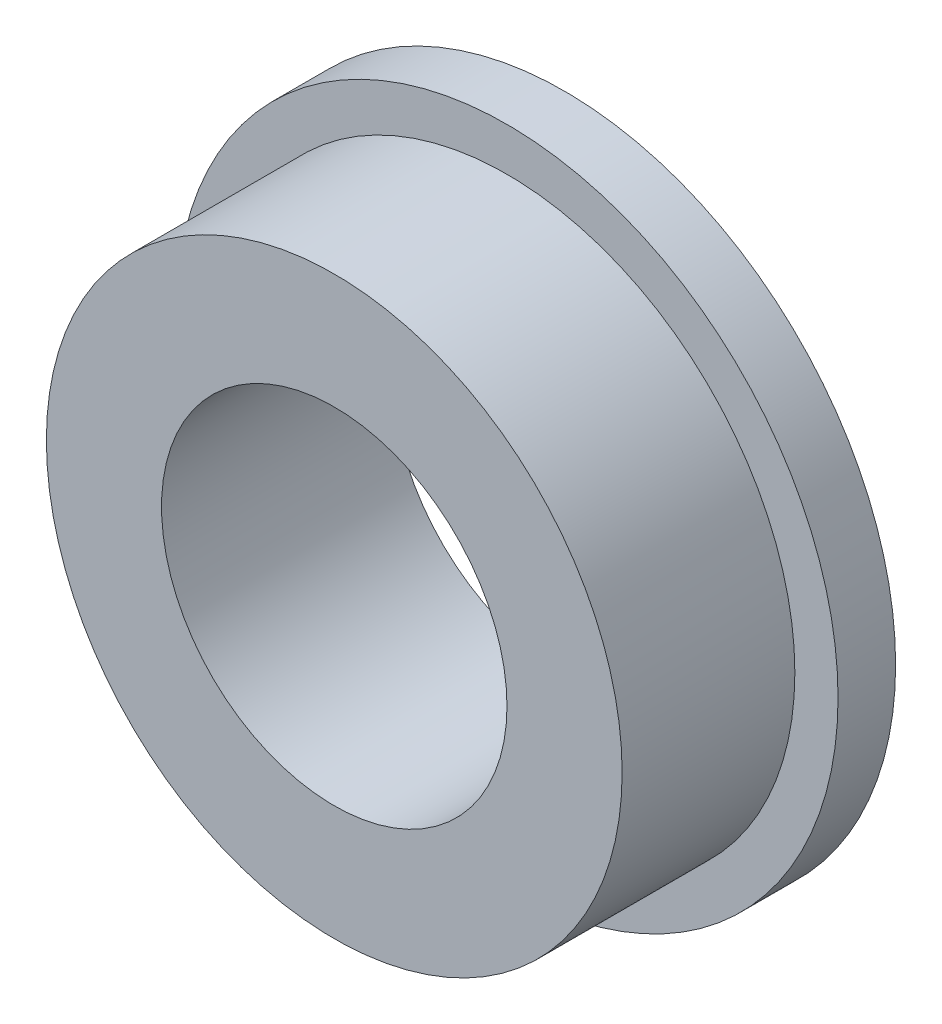
ISO-10303-21;
HEADER;
FILE_DESCRIPTION(('STEP AP214'),'2;1');
FILE_NAME('part.step','',(''),(''),'','','');
FILE_SCHEMA(('AUTOMOTIVE_DESIGN { 1 0 10303 214 1 1 1 1 }'));
ENDSEC;
DATA;
#1=APPLICATION_CONTEXT('core data for automotive mechanical design processes');
#2=APPLICATION_PROTOCOL_DEFINITION('international standard','automotive_design',2000,#1);
#3=PRODUCT_CONTEXT('',#1,'mechanical');
#4=PRODUCT('Part','Part','',(#3));
#5=PRODUCT_RELATED_PRODUCT_CATEGORY('part','',(#4));
#6=PRODUCT_DEFINITION_FORMATION('','',#4);
#7=PRODUCT_DEFINITION_CONTEXT('part definition',#1,'design');
#8=PRODUCT_DEFINITION('design','',#6,#7);
#9=PRODUCT_DEFINITION_SHAPE('','',#8);
#10=(LENGTH_UNIT() NAMED_UNIT(*) SI_UNIT(.MILLI.,.METRE.));
#11=(NAMED_UNIT(*) PLANE_ANGLE_UNIT() SI_UNIT($,.RADIAN.));
#12=(NAMED_UNIT(*) SI_UNIT($,.STERADIAN.) SOLID_ANGLE_UNIT());
#13=UNCERTAINTY_MEASURE_WITH_UNIT(LENGTH_MEASURE(1.E-05),#10,'distance_accuracy_value','');
#14=(GEOMETRIC_REPRESENTATION_CONTEXT(3) GLOBAL_UNCERTAINTY_ASSIGNED_CONTEXT((#13)) GLOBAL_UNIT_ASSIGNED_CONTEXT((#10,
#11,#12)) REPRESENTATION_CONTEXT('',''));
#15=CARTESIAN_POINT('',(0.,0.,0.));
#16=DIRECTION('',(0.,0.,1.));
#17=DIRECTION('',(1.,0.,0.));
#18=AXIS2_PLACEMENT_3D('',#15,#16,#17);
#19=CARTESIAN_POINT('',(0.,0.,4.));
#20=DIRECTION('',(0.,0.,1.));
#21=DIRECTION('',(1.,0.,0.));
#22=AXIS2_PLACEMENT_3D('',#19,#20,#21);
#23=PLANE('',#22);
#24=CARTESIAN_POINT('',(0.,0.,4.));
#25=DIRECTION('',(0.,0.,1.));
#26=DIRECTION('',(1.,0.,0.));
#27=AXIS2_PLACEMENT_3D('',#24,#25,#26);
#28=CIRCLE('',#27,5.);
#29=CARTESIAN_POINT('',(5.,0.,4.));
#30=VERTEX_POINT('',#29);
#31=EDGE_CURVE('E10',#30,#30,#28,.T.);
#32=ORIENTED_EDGE('',*,*,#31,.T.);
#33=EDGE_LOOP('',(#32));
#34=FACE_BOUND('',#33,.T.);
#35=CARTESIAN_POINT('',(0.,0.,4.));
#36=DIRECTION('',(0.,0.,1.));
#37=DIRECTION('',(1.,0.,0.));
#38=AXIS2_PLACEMENT_3D('',#35,#36,#37);
#39=CIRCLE('',#38,3.);
#40=CARTESIAN_POINT('',(3.,0.,4.));
#41=VERTEX_POINT('',#40);
#42=EDGE_CURVE('E39',#41,#41,#39,.T.);
#43=ORIENTED_EDGE('',*,*,#42,.F.);
#44=EDGE_LOOP('',(#43));
#45=FACE_BOUND('',#44,.T.);
#46=ADVANCED_FACE('F32',(#34,#45),#23,.T.);
#47=CARTESIAN_POINT('',(0.,0.,4.));
#48=DIRECTION('',(0.,0.,-1.));
#49=DIRECTION('',(-1.,0.,0.));
#50=AXIS2_PLACEMENT_3D('',#47,#48,#49);
#51=CYLINDRICAL_SURFACE('',#50,5.);
#52=CARTESIAN_POINT('',(0.,0.,1.));
#53=DIRECTION('',(0.,0.,1.));
#54=DIRECTION('',(1.,0.,0.));
#55=AXIS2_PLACEMENT_3D('',#52,#53,#54);
#56=CIRCLE('',#55,5.);
#57=CARTESIAN_POINT('',(5.,0.,1.));
#58=VERTEX_POINT('',#57);
#59=EDGE_CURVE('E47',#58,#58,#56,.T.);
#60=ORIENTED_EDGE('',*,*,#59,.T.);
#61=EDGE_LOOP('',(#60));
#62=FACE_BOUND('',#61,.T.);
#63=ORIENTED_EDGE('',*,*,#31,.F.);
#64=EDGE_LOOP('',(#63));
#65=FACE_BOUND('',#64,.T.);
#66=ADVANCED_FACE('F34',(#62,#65),#51,.T.);
#67=CARTESIAN_POINT('',(0.,0.,4.));
#68=DIRECTION('',(0.,0.,-1.));
#69=DIRECTION('',(-1.,0.,0.));
#70=AXIS2_PLACEMENT_3D('',#67,#68,#69);
#71=CYLINDRICAL_SURFACE('',#70,3.);
#72=ORIENTED_EDGE('',*,*,#42,.T.);
#73=EDGE_LOOP('',(#72));
#74=FACE_BOUND('',#73,.T.);
#75=CARTESIAN_POINT('',(0.,0.,0.));
#76=DIRECTION('',(0.,0.,1.));
#77=DIRECTION('',(1.,0.,0.));
#78=AXIS2_PLACEMENT_3D('',#75,#76,#77);
#79=CIRCLE('',#78,3.);
#80=CARTESIAN_POINT('',(3.,0.,0.));
#81=VERTEX_POINT('',#80);
#82=EDGE_CURVE('E55',#81,#81,#79,.T.);
#83=ORIENTED_EDGE('',*,*,#82,.F.);
#84=EDGE_LOOP('',(#83));
#85=FACE_BOUND('',#84,.T.);
#86=ADVANCED_FACE('F62',(#74,#85),#71,.F.);
#87=CARTESIAN_POINT('',(0.,0.,1.));
#88=DIRECTION('',(0.,0.,1.));
#89=DIRECTION('',(1.,0.,0.));
#90=AXIS2_PLACEMENT_3D('',#87,#88,#89);
#91=PLANE('',#90);
#92=ORIENTED_EDGE('',*,*,#59,.F.);
#93=EDGE_LOOP('',(#92));
#94=FACE_BOUND('',#93,.T.);
#95=CARTESIAN_POINT('',(0.,0.,1.));
#96=DIRECTION('',(0.,0.,1.));
#97=DIRECTION('',(1.,0.,0.));
#98=AXIS2_PLACEMENT_3D('',#95,#96,#97);
#99=CIRCLE('',#98,5.75);
#100=CARTESIAN_POINT('',(5.75,0.,1.));
#101=VERTEX_POINT('',#100);
#102=EDGE_CURVE('E52',#101,#101,#99,.T.);
#103=ORIENTED_EDGE('',*,*,#102,.T.);
#104=EDGE_LOOP('',(#103));
#105=FACE_BOUND('',#104,.T.);
#106=ADVANCED_FACE('F64',(#94,#105),#91,.T.);
#107=CARTESIAN_POINT('',(0.,0.,0.9));
#108=DIRECTION('',(0.,0.,-1.));
#109=DIRECTION('',(-1.,0.,0.));
#110=AXIS2_PLACEMENT_3D('',#107,#108,#109);
#111=CYLINDRICAL_SURFACE('',#110,5.75);
#112=CARTESIAN_POINT('',(0.,0.,0.));
#113=DIRECTION('',(0.,0.,1.));
#114=DIRECTION('',(1.,0.,0.));
#115=AXIS2_PLACEMENT_3D('',#112,#113,#114);
#116=CIRCLE('',#115,5.75);
#117=CARTESIAN_POINT('',(5.75,0.,0.));
#118=VERTEX_POINT('',#117);
#119=EDGE_CURVE('E43',#118,#118,#116,.T.);
#120=ORIENTED_EDGE('',*,*,#119,.T.);
#121=EDGE_LOOP('',(#120));
#122=FACE_BOUND('',#121,.T.);
#123=ORIENTED_EDGE('',*,*,#102,.F.);
#124=EDGE_LOOP('',(#123));
#125=FACE_BOUND('',#124,.T.);
#126=ADVANCED_FACE('F70',(#122,#125),#111,.T.);
#127=CARTESIAN_POINT('',(0.,0.,0.));
#128=DIRECTION('',(0.,0.,1.));
#129=DIRECTION('',(1.,0.,0.));
#130=AXIS2_PLACEMENT_3D('',#127,#128,#129);
#131=PLANE('',#130);
#132=ORIENTED_EDGE('',*,*,#82,.T.);
#133=EDGE_LOOP('',(#132));
#134=FACE_BOUND('',#133,.T.);
#135=ORIENTED_EDGE('',*,*,#119,.F.);
#136=EDGE_LOOP('',(#135));
#137=FACE_BOUND('',#136,.T.);
#138=ADVANCED_FACE('F59',(#134,#137),#131,.F.);
#139=CLOSED_SHELL('',(#46,#66,#86,#106,#126,#138));
#140=MANIFOLD_SOLID_BREP('B2',#139);
#141=ADVANCED_BREP_SHAPE_REPRESENTATION('',(#18,#140),#14);
#142=SHAPE_DEFINITION_REPRESENTATION(#9,#141);
ENDSEC;
END-ISO-10303-21;
